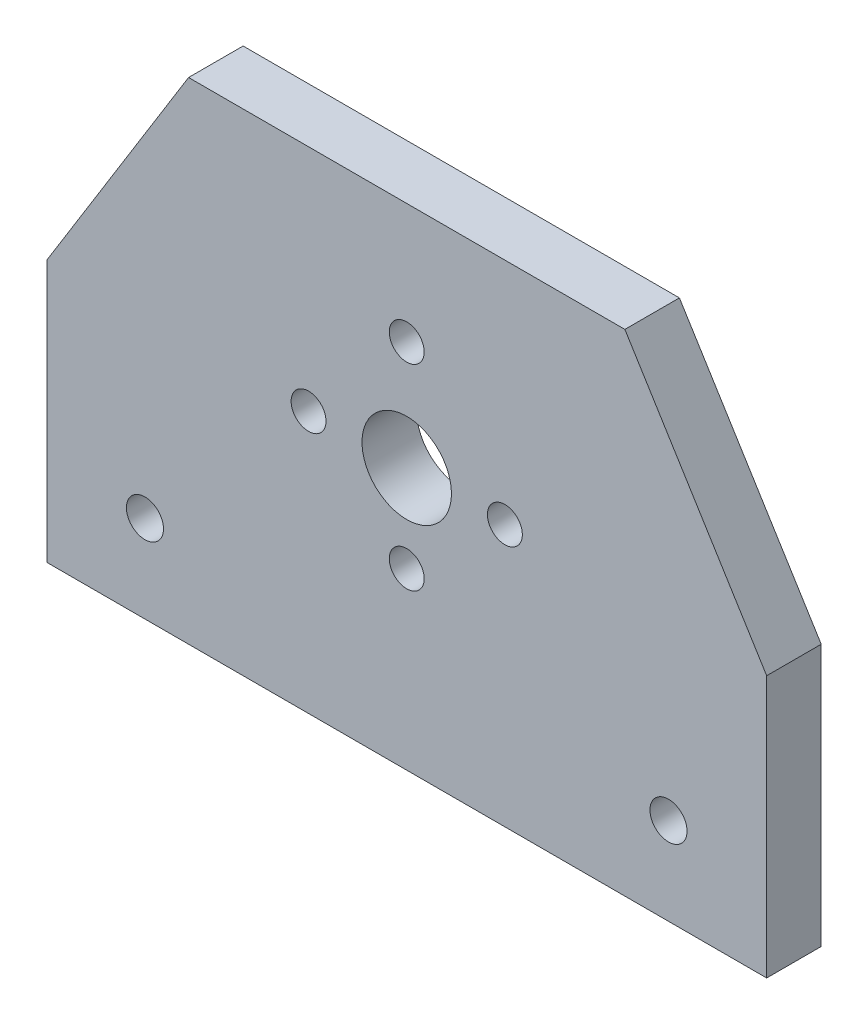
ISO-10303-21;
HEADER;
FILE_DESCRIPTION(('STEP AP214'),'2;1');
FILE_NAME('part.step','',(''),(''),'','','');
FILE_SCHEMA(('AUTOMOTIVE_DESIGN { 1 0 10303 214 1 1 1 1 }'));
ENDSEC;
DATA;
#1=APPLICATION_CONTEXT('core data for automotive mechanical design processes');
#2=APPLICATION_PROTOCOL_DEFINITION('international standard','automotive_design',2000,#1);
#3=PRODUCT_CONTEXT('',#1,'mechanical');
#4=PRODUCT('Part','Part','',(#3));
#5=PRODUCT_RELATED_PRODUCT_CATEGORY('part','',(#4));
#6=PRODUCT_DEFINITION_FORMATION('','',#4);
#7=PRODUCT_DEFINITION_CONTEXT('part definition',#1,'design');
#8=PRODUCT_DEFINITION('design','',#6,#7);
#9=PRODUCT_DEFINITION_SHAPE('','',#8);
#10=(LENGTH_UNIT() NAMED_UNIT(*) SI_UNIT(.MILLI.,.METRE.));
#11=(NAMED_UNIT(*) PLANE_ANGLE_UNIT() SI_UNIT($,.RADIAN.));
#12=(NAMED_UNIT(*) SI_UNIT($,.STERADIAN.) SOLID_ANGLE_UNIT());
#13=UNCERTAINTY_MEASURE_WITH_UNIT(LENGTH_MEASURE(1.E-05),#10,'distance_accuracy_value','');
#14=(GEOMETRIC_REPRESENTATION_CONTEXT(3) GLOBAL_UNCERTAINTY_ASSIGNED_CONTEXT((#13)) GLOBAL_UNIT_ASSIGNED_CONTEXT((#10,
#11,#12)) REPRESENTATION_CONTEXT('',''));
#15=CARTESIAN_POINT('',(0.,0.,0.));
#16=DIRECTION('',(0.,0.,1.));
#17=DIRECTION('',(1.,0.,0.));
#18=AXIS2_PLACEMENT_3D('',#15,#16,#17);
#19=CARTESIAN_POINT('',(0.,0.,5.));
#20=DIRECTION('',(0.,0.,1.));
#21=DIRECTION('',(1.,0.,0.));
#22=AXIS2_PLACEMENT_3D('',#19,#20,#21);
#23=PLANE('',#22);
#24=CARTESIAN_POINT('',(-24.,8.,5.));
#25=DIRECTION('',(0.,0.,1.));
#26=DIRECTION('',(1.,0.,0.));
#27=AXIS2_PLACEMENT_3D('',#24,#25,#26);
#28=CIRCLE('',#27,1.7);
#29=CARTESIAN_POINT('',(-22.3,8.,5.));
#30=VERTEX_POINT('',#29);
#31=EDGE_CURVE('E209',#30,#30,#28,.T.);
#32=ORIENTED_EDGE('',*,*,#31,.F.);
#33=EDGE_LOOP('',(#32));
#34=FACE_BOUND('',#33,.T.);
#35=CARTESIAN_POINT('',(0.,16.,5.));
#36=DIRECTION('',(0.,0.,1.));
#37=DIRECTION('',(1.,0.,0.));
#38=AXIS2_PLACEMENT_3D('',#35,#36,#37);
#39=CIRCLE('',#38,1.6);
#40=CARTESIAN_POINT('',(1.6,16.,5.));
#41=VERTEX_POINT('',#40);
#42=EDGE_CURVE('E221',#41,#41,#39,.T.);
#43=ORIENTED_EDGE('',*,*,#42,.F.);
#44=EDGE_LOOP('',(#43));
#45=FACE_BOUND('',#44,.T.);
#46=CARTESIAN_POINT('',(-9.,24.,5.));
#47=DIRECTION('',(0.,0.,1.));
#48=DIRECTION('',(1.,0.,0.));
#49=AXIS2_PLACEMENT_3D('',#46,#47,#48);
#50=CIRCLE('',#49,1.6);
#51=CARTESIAN_POINT('',(-7.4,24.,5.));
#52=VERTEX_POINT('',#51);
#53=EDGE_CURVE('E233',#52,#52,#50,.T.);
#54=ORIENTED_EDGE('',*,*,#53,.F.);
#55=EDGE_LOOP('',(#54));
#56=FACE_BOUND('',#55,.T.);
#57=DIRECTION('',(0.,-1.,0.));
#58=VECTOR('',#57,1.);
#59=CARTESIAN_POINT('',(-33.,24.,5.));
#60=LINE('',#59,#58);
#61=CARTESIAN_POINT('',(-33.,24.,5.));
#62=VERTEX_POINT('',#61);
#63=CARTESIAN_POINT('',(-33.,0.,5.));
#64=VERTEX_POINT('',#63);
#65=EDGE_CURVE('E137',#62,#64,#60,.T.);
#66=ORIENTED_EDGE('',*,*,#65,.T.);
#67=DIRECTION('',(1.,0.,0.));
#68=VECTOR('',#67,1.);
#69=CARTESIAN_POINT('',(-33.,0.,5.));
#70=LINE('',#69,#68);
#71=CARTESIAN_POINT('',(33.,0.,5.));
#72=VERTEX_POINT('',#71);
#73=EDGE_CURVE('E95',#64,#72,#70,.T.);
#74=ORIENTED_EDGE('',*,*,#73,.T.);
#75=DIRECTION('',(0.,1.,0.));
#76=VECTOR('',#75,1.);
#77=CARTESIAN_POINT('',(33.,0.,5.));
#78=LINE('',#77,#76);
#79=CARTESIAN_POINT('',(33.,24.,5.));
#80=VERTEX_POINT('',#79);
#81=EDGE_CURVE('E108',#72,#80,#78,.T.);
#82=ORIENTED_EDGE('',*,*,#81,.T.);
#83=DIRECTION('',(-0.526354614616296,0.850265146687862,0.));
#84=VECTOR('',#83,1.);
#85=CARTESIAN_POINT('',(33.,24.,5.));
#86=LINE('',#85,#84);
#87=CARTESIAN_POINT('',(20.,45.,5.));
#88=VERTEX_POINT('',#87);
#89=EDGE_CURVE('E102',#80,#88,#86,.T.);
#90=ORIENTED_EDGE('',*,*,#89,.T.);
#91=DIRECTION('',(-1.,0.,0.));
#92=VECTOR('',#91,1.);
#93=CARTESIAN_POINT('',(20.,45.,5.));
#94=LINE('',#93,#92);
#95=CARTESIAN_POINT('',(-20.,45.,5.));
#96=VERTEX_POINT('',#95);
#97=EDGE_CURVE('E106',#88,#96,#94,.T.);
#98=ORIENTED_EDGE('',*,*,#97,.T.);
#99=DIRECTION('',(-0.526354614616296,-0.850265146687862,0.));
#100=VECTOR('',#99,1.);
#101=CARTESIAN_POINT('',(-20.,45.,5.));
#102=LINE('',#101,#100);
#103=EDGE_CURVE('E58',#96,#62,#102,.T.);
#104=ORIENTED_EDGE('',*,*,#103,.T.);
#105=EDGE_LOOP('',(#66,#74,#82,#90,#98,#104));
#106=FACE_BOUND('',#105,.T.);
#107=CARTESIAN_POINT('',(0.,24.,5.));
#108=DIRECTION('',(0.,0.,1.));
#109=DIRECTION('',(1.,0.,0.));
#110=AXIS2_PLACEMENT_3D('',#107,#108,#109);
#111=CIRCLE('',#110,4.1);
#112=CARTESIAN_POINT('',(4.1,24.,5.));
#113=VERTEX_POINT('',#112);
#114=EDGE_CURVE('E130',#113,#113,#111,.T.);
#115=ORIENTED_EDGE('',*,*,#114,.F.);
#116=EDGE_LOOP('',(#115));
#117=FACE_BOUND('',#116,.T.);
#118=CARTESIAN_POINT('',(9.,24.,5.));
#119=DIRECTION('',(0.,0.,1.));
#120=DIRECTION('',(1.,0.,0.));
#121=AXIS2_PLACEMENT_3D('',#118,#119,#120);
#122=CIRCLE('',#121,1.6);
#123=CARTESIAN_POINT('',(10.6,24.,5.));
#124=VERTEX_POINT('',#123);
#125=EDGE_CURVE('E227',#124,#124,#122,.T.);
#126=ORIENTED_EDGE('',*,*,#125,.F.);
#127=EDGE_LOOP('',(#126));
#128=FACE_BOUND('',#127,.T.);
#129=CARTESIAN_POINT('',(0.,34.,5.));
#130=DIRECTION('',(0.,0.,1.));
#131=DIRECTION('',(1.,0.,0.));
#132=AXIS2_PLACEMENT_3D('',#129,#130,#131);
#133=CIRCLE('',#132,1.6);
#134=CARTESIAN_POINT('',(1.6,34.,5.));
#135=VERTEX_POINT('',#134);
#136=EDGE_CURVE('E215',#135,#135,#133,.T.);
#137=ORIENTED_EDGE('',*,*,#136,.F.);
#138=EDGE_LOOP('',(#137));
#139=FACE_BOUND('',#138,.T.);
#140=CARTESIAN_POINT('',(24.,8.,5.));
#141=DIRECTION('',(0.,0.,1.));
#142=DIRECTION('',(1.,0.,0.));
#143=AXIS2_PLACEMENT_3D('',#140,#141,#142);
#144=CIRCLE('',#143,1.7);
#145=CARTESIAN_POINT('',(25.7,8.,5.));
#146=VERTEX_POINT('',#145);
#147=EDGE_CURVE('E200',#146,#146,#144,.T.);
#148=ORIENTED_EDGE('',*,*,#147,.F.);
#149=EDGE_LOOP('',(#148));
#150=FACE_BOUND('',#149,.T.);
#151=ADVANCED_FACE('F41',(#34,#45,#56,#106,#117,#128,#139,#150),#23,.T.);
#152=CARTESIAN_POINT('',(0.,0.,0.));
#153=DIRECTION('',(0.,0.,1.));
#154=DIRECTION('',(1.,0.,0.));
#155=AXIS2_PLACEMENT_3D('',#152,#153,#154);
#156=PLANE('',#155);
#157=DIRECTION('',(0.,-1.,0.));
#158=VECTOR('',#157,1.);
#159=CARTESIAN_POINT('',(-33.,24.,0.));
#160=LINE('',#159,#158);
#161=CARTESIAN_POINT('',(-33.,24.,0.));
#162=VERTEX_POINT('',#161);
#163=CARTESIAN_POINT('',(-33.,0.,0.));
#164=VERTEX_POINT('',#163);
#165=EDGE_CURVE('E126',#162,#164,#160,.T.);
#166=ORIENTED_EDGE('',*,*,#165,.F.);
#167=DIRECTION('',(-0.526354614616296,-0.850265146687862,0.));
#168=VECTOR('',#167,1.);
#169=CARTESIAN_POINT('',(-20.,45.,0.));
#170=LINE('',#169,#168);
#171=CARTESIAN_POINT('',(-20.,45.,0.));
#172=VERTEX_POINT('',#171);
#173=EDGE_CURVE('E87',#172,#162,#170,.T.);
#174=ORIENTED_EDGE('',*,*,#173,.F.);
#175=DIRECTION('',(-1.,0.,0.));
#176=VECTOR('',#175,1.);
#177=CARTESIAN_POINT('',(20.,45.,0.));
#178=LINE('',#177,#176);
#179=CARTESIAN_POINT('',(20.,45.,0.));
#180=VERTEX_POINT('',#179);
#181=EDGE_CURVE('E81',#180,#172,#178,.T.);
#182=ORIENTED_EDGE('',*,*,#181,.F.);
#183=DIRECTION('',(-0.526354614616296,0.850265146687862,0.));
#184=VECTOR('',#183,1.);
#185=CARTESIAN_POINT('',(33.,24.,0.));
#186=LINE('',#185,#184);
#187=CARTESIAN_POINT('',(33.,24.,0.));
#188=VERTEX_POINT('',#187);
#189=EDGE_CURVE('E116',#188,#180,#186,.T.);
#190=ORIENTED_EDGE('',*,*,#189,.F.);
#191=DIRECTION('',(0.,1.,0.));
#192=VECTOR('',#191,1.);
#193=CARTESIAN_POINT('',(33.,0.,0.));
#194=LINE('',#193,#192);
#195=CARTESIAN_POINT('',(33.,0.,0.));
#196=VERTEX_POINT('',#195);
#197=EDGE_CURVE('E132',#196,#188,#194,.T.);
#198=ORIENTED_EDGE('',*,*,#197,.F.);
#199=DIRECTION('',(1.,0.,0.));
#200=VECTOR('',#199,1.);
#201=CARTESIAN_POINT('',(-33.,0.,0.));
#202=LINE('',#201,#200);
#203=EDGE_CURVE('E129',#164,#196,#202,.T.);
#204=ORIENTED_EDGE('',*,*,#203,.F.);
#205=EDGE_LOOP('',(#166,#174,#182,#190,#198,#204));
#206=FACE_BOUND('',#205,.T.);
#207=CARTESIAN_POINT('',(0.,24.,0.));
#208=DIRECTION('',(0.,0.,1.));
#209=DIRECTION('',(1.,0.,0.));
#210=AXIS2_PLACEMENT_3D('',#207,#208,#209);
#211=CIRCLE('',#210,4.1);
#212=CARTESIAN_POINT('',(4.1,24.,0.));
#213=VERTEX_POINT('',#212);
#214=EDGE_CURVE('E236',#213,#213,#211,.T.);
#215=ORIENTED_EDGE('',*,*,#214,.T.);
#216=EDGE_LOOP('',(#215));
#217=FACE_BOUND('',#216,.T.);
#218=CARTESIAN_POINT('',(-9.,24.,0.));
#219=DIRECTION('',(0.,0.,1.));
#220=DIRECTION('',(1.,0.,0.));
#221=AXIS2_PLACEMENT_3D('',#218,#219,#220);
#222=CIRCLE('',#221,1.6);
#223=CARTESIAN_POINT('',(-7.4,24.,0.));
#224=VERTEX_POINT('',#223);
#225=EDGE_CURVE('E230',#224,#224,#222,.T.);
#226=ORIENTED_EDGE('',*,*,#225,.T.);
#227=EDGE_LOOP('',(#226));
#228=FACE_BOUND('',#227,.T.);
#229=CARTESIAN_POINT('',(9.,24.,0.));
#230=DIRECTION('',(0.,0.,1.));
#231=DIRECTION('',(1.,0.,0.));
#232=AXIS2_PLACEMENT_3D('',#229,#230,#231);
#233=CIRCLE('',#232,1.6);
#234=CARTESIAN_POINT('',(10.6,24.,0.));
#235=VERTEX_POINT('',#234);
#236=EDGE_CURVE('E224',#235,#235,#233,.T.);
#237=ORIENTED_EDGE('',*,*,#236,.T.);
#238=EDGE_LOOP('',(#237));
#239=FACE_BOUND('',#238,.T.);
#240=CARTESIAN_POINT('',(0.,16.,0.));
#241=DIRECTION('',(0.,0.,1.));
#242=DIRECTION('',(1.,0.,0.));
#243=AXIS2_PLACEMENT_3D('',#240,#241,#242);
#244=CIRCLE('',#243,1.6);
#245=CARTESIAN_POINT('',(1.6,16.,0.));
#246=VERTEX_POINT('',#245);
#247=EDGE_CURVE('E218',#246,#246,#244,.T.);
#248=ORIENTED_EDGE('',*,*,#247,.T.);
#249=EDGE_LOOP('',(#248));
#250=FACE_BOUND('',#249,.T.);
#251=CARTESIAN_POINT('',(0.,34.,0.));
#252=DIRECTION('',(0.,0.,1.));
#253=DIRECTION('',(1.,0.,0.));
#254=AXIS2_PLACEMENT_3D('',#251,#252,#253);
#255=CIRCLE('',#254,1.6);
#256=CARTESIAN_POINT('',(1.6,34.,0.));
#257=VERTEX_POINT('',#256);
#258=EDGE_CURVE('E212',#257,#257,#255,.T.);
#259=ORIENTED_EDGE('',*,*,#258,.T.);
#260=EDGE_LOOP('',(#259));
#261=FACE_BOUND('',#260,.T.);
#262=CARTESIAN_POINT('',(-24.,8.,0.));
#263=DIRECTION('',(0.,0.,1.));
#264=DIRECTION('',(1.,0.,0.));
#265=AXIS2_PLACEMENT_3D('',#262,#263,#264);
#266=CIRCLE('',#265,1.7);
#267=CARTESIAN_POINT('',(-22.3,8.,0.));
#268=VERTEX_POINT('',#267);
#269=EDGE_CURVE('E206',#268,#268,#266,.T.);
#270=ORIENTED_EDGE('',*,*,#269,.T.);
#271=EDGE_LOOP('',(#270));
#272=FACE_BOUND('',#271,.T.);
#273=CARTESIAN_POINT('',(24.,8.,0.));
#274=DIRECTION('',(0.,0.,1.));
#275=DIRECTION('',(1.,0.,0.));
#276=AXIS2_PLACEMENT_3D('',#273,#274,#275);
#277=CIRCLE('',#276,1.7);
#278=CARTESIAN_POINT('',(25.7,8.,0.));
#279=VERTEX_POINT('',#278);
#280=EDGE_CURVE('E203',#279,#279,#277,.T.);
#281=ORIENTED_EDGE('',*,*,#280,.T.);
#282=EDGE_LOOP('',(#281));
#283=FACE_BOUND('',#282,.T.);
#284=ADVANCED_FACE('F146',(#206,#217,#228,#239,#250,#261,#272,#283),#156,.F.);
#285=CARTESIAN_POINT('',(-33.,24.,5.));
#286=DIRECTION('',(1.,0.,0.));
#287=DIRECTION('',(0.,0.,-1.));
#288=AXIS2_PLACEMENT_3D('',#285,#286,#287);
#289=PLANE('',#288);
#290=ORIENTED_EDGE('',*,*,#165,.T.);
#291=DIRECTION('',(0.,0.,-1.));
#292=VECTOR('',#291,1.);
#293=CARTESIAN_POINT('',(-33.,0.,5.));
#294=LINE('',#293,#292);
#295=EDGE_CURVE('E11',#64,#164,#294,.T.);
#296=ORIENTED_EDGE('',*,*,#295,.F.);
#297=ORIENTED_EDGE('',*,*,#65,.F.);
#298=DIRECTION('',(0.,0.,-1.));
#299=VECTOR('',#298,1.);
#300=CARTESIAN_POINT('',(-33.,24.,5.));
#301=LINE('',#300,#299);
#302=EDGE_CURVE('E122',#62,#162,#301,.T.);
#303=ORIENTED_EDGE('',*,*,#302,.T.);
#304=EDGE_LOOP('',(#290,#296,#297,#303));
#305=FACE_BOUND('',#304,.T.);
#306=ADVANCED_FACE('F43',(#305),#289,.F.);
#307=CARTESIAN_POINT('',(-33.,0.,5.));
#308=DIRECTION('',(0.,1.,0.));
#309=DIRECTION('',(0.,0.,1.));
#310=AXIS2_PLACEMENT_3D('',#307,#308,#309);
#311=PLANE('',#310);
#312=ORIENTED_EDGE('',*,*,#203,.T.);
#313=DIRECTION('',(0.,0.,-1.));
#314=VECTOR('',#313,1.);
#315=CARTESIAN_POINT('',(33.,0.,5.));
#316=LINE('',#315,#314);
#317=EDGE_CURVE('E50',#72,#196,#316,.T.);
#318=ORIENTED_EDGE('',*,*,#317,.F.);
#319=ORIENTED_EDGE('',*,*,#73,.F.);
#320=ORIENTED_EDGE('',*,*,#295,.T.);
#321=EDGE_LOOP('',(#312,#318,#319,#320));
#322=FACE_BOUND('',#321,.T.);
#323=ADVANCED_FACE('F328',(#322),#311,.F.);
#324=CARTESIAN_POINT('',(33.,0.,5.));
#325=DIRECTION('',(-1.,0.,0.));
#326=DIRECTION('',(0.,0.,1.));
#327=AXIS2_PLACEMENT_3D('',#324,#325,#326);
#328=PLANE('',#327);
#329=ORIENTED_EDGE('',*,*,#197,.T.);
#330=DIRECTION('',(0.,0.,-1.));
#331=VECTOR('',#330,1.);
#332=CARTESIAN_POINT('',(33.,24.,5.));
#333=LINE('',#332,#331);
#334=EDGE_CURVE('E117',#80,#188,#333,.T.);
#335=ORIENTED_EDGE('',*,*,#334,.F.);
#336=ORIENTED_EDGE('',*,*,#81,.F.);
#337=ORIENTED_EDGE('',*,*,#317,.T.);
#338=EDGE_LOOP('',(#329,#335,#336,#337));
#339=FACE_BOUND('',#338,.T.);
#340=ADVANCED_FACE('F143',(#339),#328,.F.);
#341=CARTESIAN_POINT('',(33.,24.,5.));
#342=DIRECTION('',(-0.850265146687862,-0.526354614616296,0.));
#343=DIRECTION('',(0.526354614616296,-0.850265146687862,0.));
#344=AXIS2_PLACEMENT_3D('',#341,#342,#343);
#345=PLANE('',#344);
#346=ORIENTED_EDGE('',*,*,#189,.T.);
#347=DIRECTION('',(0.,0.,-1.));
#348=VECTOR('',#347,1.);
#349=CARTESIAN_POINT('',(20.,45.,5.));
#350=LINE('',#349,#348);
#351=EDGE_CURVE('E113',#88,#180,#350,.T.);
#352=ORIENTED_EDGE('',*,*,#351,.F.);
#353=ORIENTED_EDGE('',*,*,#89,.F.);
#354=ORIENTED_EDGE('',*,*,#334,.T.);
#355=EDGE_LOOP('',(#346,#352,#353,#354));
#356=FACE_BOUND('',#355,.T.);
#357=ADVANCED_FACE('F114',(#356),#345,.F.);
#358=CARTESIAN_POINT('',(20.,45.,5.));
#359=DIRECTION('',(0.,-1.,0.));
#360=DIRECTION('',(0.,0.,-1.));
#361=AXIS2_PLACEMENT_3D('',#358,#359,#360);
#362=PLANE('',#361);
#363=ORIENTED_EDGE('',*,*,#181,.T.);
#364=DIRECTION('',(0.,0.,-1.));
#365=VECTOR('',#364,1.);
#366=CARTESIAN_POINT('',(-20.,45.,5.));
#367=LINE('',#366,#365);
#368=EDGE_CURVE('E118',#96,#172,#367,.T.);
#369=ORIENTED_EDGE('',*,*,#368,.F.);
#370=ORIENTED_EDGE('',*,*,#97,.F.);
#371=ORIENTED_EDGE('',*,*,#351,.T.);
#372=EDGE_LOOP('',(#363,#369,#370,#371));
#373=FACE_BOUND('',#372,.T.);
#374=ADVANCED_FACE('F120',(#373),#362,.F.);
#375=CARTESIAN_POINT('',(-20.,45.,5.));
#376=DIRECTION('',(0.850265146687862,-0.526354614616296,0.));
#377=DIRECTION('',(0.526354614616296,0.850265146687862,0.));
#378=AXIS2_PLACEMENT_3D('',#375,#376,#377);
#379=PLANE('',#378);
#380=ORIENTED_EDGE('',*,*,#173,.T.);
#381=ORIENTED_EDGE('',*,*,#302,.F.);
#382=ORIENTED_EDGE('',*,*,#103,.F.);
#383=ORIENTED_EDGE('',*,*,#368,.T.);
#384=EDGE_LOOP('',(#380,#381,#382,#383));
#385=FACE_BOUND('',#384,.T.);
#386=ADVANCED_FACE('F151',(#385),#379,.F.);
#387=CARTESIAN_POINT('',(0.,24.,5.));
#388=DIRECTION('',(0.,0.,-1.));
#389=DIRECTION('',(-1.,0.,0.));
#390=AXIS2_PLACEMENT_3D('',#387,#388,#389);
#391=CYLINDRICAL_SURFACE('',#390,4.1);
#392=ORIENTED_EDGE('',*,*,#114,.T.);
#393=EDGE_LOOP('',(#392));
#394=FACE_BOUND('',#393,.T.);
#395=ORIENTED_EDGE('',*,*,#214,.F.);
#396=EDGE_LOOP('',(#395));
#397=FACE_BOUND('',#396,.T.);
#398=ADVANCED_FACE('F153',(#394,#397),#391,.F.);
#399=CARTESIAN_POINT('',(-9.,24.,5.));
#400=DIRECTION('',(0.,0.,-1.));
#401=DIRECTION('',(-1.,0.,0.));
#402=AXIS2_PLACEMENT_3D('',#399,#400,#401);
#403=CYLINDRICAL_SURFACE('',#402,1.6);
#404=ORIENTED_EDGE('',*,*,#53,.T.);
#405=EDGE_LOOP('',(#404));
#406=FACE_BOUND('',#405,.T.);
#407=ORIENTED_EDGE('',*,*,#225,.F.);
#408=EDGE_LOOP('',(#407));
#409=FACE_BOUND('',#408,.T.);
#410=ADVANCED_FACE('F159',(#406,#409),#403,.F.);
#411=CARTESIAN_POINT('',(9.,24.,5.));
#412=DIRECTION('',(0.,0.,-1.));
#413=DIRECTION('',(-1.,0.,0.));
#414=AXIS2_PLACEMENT_3D('',#411,#412,#413);
#415=CYLINDRICAL_SURFACE('',#414,1.6);
#416=ORIENTED_EDGE('',*,*,#125,.T.);
#417=EDGE_LOOP('',(#416));
#418=FACE_BOUND('',#417,.T.);
#419=ORIENTED_EDGE('',*,*,#236,.F.);
#420=EDGE_LOOP('',(#419));
#421=FACE_BOUND('',#420,.T.);
#422=ADVANCED_FACE('F175',(#418,#421),#415,.F.);
#423=CARTESIAN_POINT('',(0.,16.,5.));
#424=DIRECTION('',(0.,0.,-1.));
#425=DIRECTION('',(-1.,0.,0.));
#426=AXIS2_PLACEMENT_3D('',#423,#424,#425);
#427=CYLINDRICAL_SURFACE('',#426,1.6);
#428=ORIENTED_EDGE('',*,*,#42,.T.);
#429=EDGE_LOOP('',(#428));
#430=FACE_BOUND('',#429,.T.);
#431=ORIENTED_EDGE('',*,*,#247,.F.);
#432=EDGE_LOOP('',(#431));
#433=FACE_BOUND('',#432,.T.);
#434=ADVANCED_FACE('F179',(#430,#433),#427,.F.);
#435=CARTESIAN_POINT('',(0.,34.,5.));
#436=DIRECTION('',(0.,0.,-1.));
#437=DIRECTION('',(-1.,0.,0.));
#438=AXIS2_PLACEMENT_3D('',#435,#436,#437);
#439=CYLINDRICAL_SURFACE('',#438,1.6);
#440=ORIENTED_EDGE('',*,*,#136,.T.);
#441=EDGE_LOOP('',(#440));
#442=FACE_BOUND('',#441,.T.);
#443=ORIENTED_EDGE('',*,*,#258,.F.);
#444=EDGE_LOOP('',(#443));
#445=FACE_BOUND('',#444,.T.);
#446=ADVANCED_FACE('F183',(#442,#445),#439,.F.);
#447=CARTESIAN_POINT('',(-24.,8.,5.));
#448=DIRECTION('',(0.,0.,-1.));
#449=DIRECTION('',(-1.,0.,0.));
#450=AXIS2_PLACEMENT_3D('',#447,#448,#449);
#451=CYLINDRICAL_SURFACE('',#450,1.7);
#452=ORIENTED_EDGE('',*,*,#31,.T.);
#453=EDGE_LOOP('',(#452));
#454=FACE_BOUND('',#453,.T.);
#455=ORIENTED_EDGE('',*,*,#269,.F.);
#456=EDGE_LOOP('',(#455));
#457=FACE_BOUND('',#456,.T.);
#458=ADVANCED_FACE('F187',(#454,#457),#451,.F.);
#459=CARTESIAN_POINT('',(24.,8.,5.));
#460=DIRECTION('',(0.,0.,-1.));
#461=DIRECTION('',(-1.,0.,0.));
#462=AXIS2_PLACEMENT_3D('',#459,#460,#461);
#463=CYLINDRICAL_SURFACE('',#462,1.7);
#464=ORIENTED_EDGE('',*,*,#147,.T.);
#465=EDGE_LOOP('',(#464));
#466=FACE_BOUND('',#465,.T.);
#467=ORIENTED_EDGE('',*,*,#280,.F.);
#468=EDGE_LOOP('',(#467));
#469=FACE_BOUND('',#468,.T.);
#470=ADVANCED_FACE('F191',(#466,#469),#463,.F.);
#471=CLOSED_SHELL('',(#151,#284,#306,#323,#340,#357,#374,#386,#398,#410,#422,#434,#446,#458,#470));
#472=MANIFOLD_SOLID_BREP('B2',#471);
#473=ADVANCED_BREP_SHAPE_REPRESENTATION('',(#18,#472),#14);
#474=SHAPE_DEFINITION_REPRESENTATION(#9,#473);
ENDSEC;
END-ISO-10303-21;
